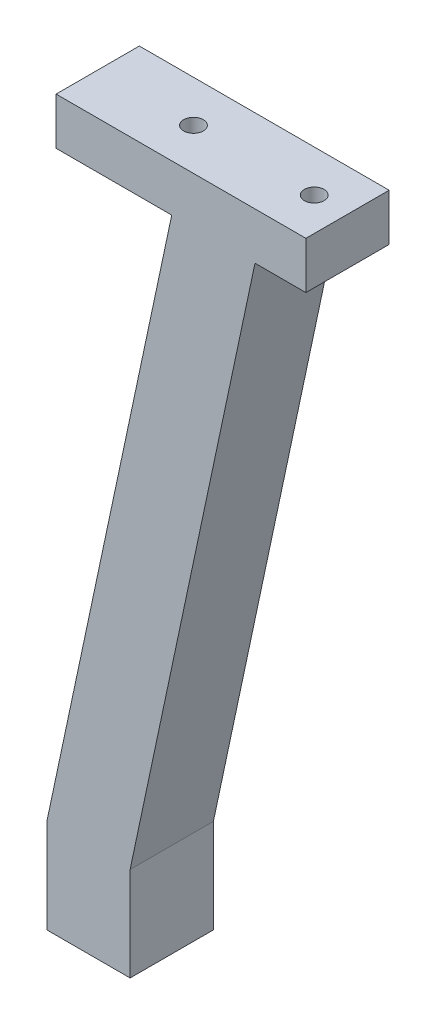
ISO-10303-21;
HEADER;
FILE_DESCRIPTION(('STEP AP214'),'2;1');
FILE_NAME('part.step','',(''),(''),'','','');
FILE_SCHEMA(('AUTOMOTIVE_DESIGN { 1 0 10303 214 1 1 1 1 }'));
ENDSEC;
DATA;
#1=APPLICATION_CONTEXT('core data for automotive mechanical design processes');
#2=APPLICATION_PROTOCOL_DEFINITION('international standard','automotive_design',2000,#1);
#3=PRODUCT_CONTEXT('',#1,'mechanical');
#4=PRODUCT('Part','Part','',(#3));
#5=PRODUCT_RELATED_PRODUCT_CATEGORY('part','',(#4));
#6=PRODUCT_DEFINITION_FORMATION('','',#4);
#7=PRODUCT_DEFINITION_CONTEXT('part definition',#1,'design');
#8=PRODUCT_DEFINITION('design','',#6,#7);
#9=PRODUCT_DEFINITION_SHAPE('','',#8);
#10=(LENGTH_UNIT() NAMED_UNIT(*) SI_UNIT(.MILLI.,.METRE.));
#11=(NAMED_UNIT(*) PLANE_ANGLE_UNIT() SI_UNIT($,.RADIAN.));
#12=(NAMED_UNIT(*) SI_UNIT($,.STERADIAN.) SOLID_ANGLE_UNIT());
#13=UNCERTAINTY_MEASURE_WITH_UNIT(LENGTH_MEASURE(1.E-05),#10,'distance_accuracy_value','');
#14=(GEOMETRIC_REPRESENTATION_CONTEXT(3) GLOBAL_UNCERTAINTY_ASSIGNED_CONTEXT((#13)) GLOBAL_UNIT_ASSIGNED_CONTEXT((#10,
#11,#12)) REPRESENTATION_CONTEXT('',''));
#15=CARTESIAN_POINT('',(0.,0.,0.));
#16=DIRECTION('',(0.,0.,1.));
#17=DIRECTION('',(1.,0.,0.));
#18=AXIS2_PLACEMENT_3D('',#15,#16,#17);
#19=CARTESIAN_POINT('',(37.8942820549233,137.16,-0.398563085800959));
#20=DIRECTION('',(0.,-1.,0.));
#21=DIRECTION('',(0.,0.,-1.));
#22=AXIS2_PLACEMENT_3D('',#19,#20,#21);
#23=CYLINDRICAL_SURFACE('',#22,2.125);
#24=CARTESIAN_POINT('',(37.8942820549233,137.16,-0.398563085800959));
#25=DIRECTION('',(0.,-1.,0.));
#26=DIRECTION('',(0.,0.,-1.));
#27=AXIS2_PLACEMENT_3D('',#24,#25,#26);
#28=CIRCLE('',#27,2.125);
#29=CARTESIAN_POINT('',(37.8942820549233,137.16,-2.52356308580096));
#30=VERTEX_POINT('',#29);
#31=EDGE_CURVE('E246',#30,#30,#28,.T.);
#32=ORIENTED_EDGE('',*,*,#31,.F.);
#33=EDGE_LOOP('',(#32));
#34=FACE_BOUND('',#33,.T.);
#35=CARTESIAN_POINT('',(37.8942820549233,130.,-0.398563085800959));
#36=DIRECTION('',(0.,-1.,0.));
#37=DIRECTION('',(0.,0.,-1.));
#38=AXIS2_PLACEMENT_3D('',#35,#36,#37);
#39=CIRCLE('',#38,2.125);
#40=CARTESIAN_POINT('',(37.8942820549233,130.,-2.52356308580096));
#41=VERTEX_POINT('',#40);
#42=EDGE_CURVE('E233',#41,#41,#39,.F.);
#43=ORIENTED_EDGE('',*,*,#42,.F.);
#44=EDGE_LOOP('',(#43));
#45=FACE_BOUND('',#44,.T.);
#46=ADVANCED_FACE('F35',(#34,#45),#23,.F.);
#47=CARTESIAN_POINT('',(11.7942820549233,137.16,-0.398563085800959));
#48=DIRECTION('',(0.,-1.,0.));
#49=DIRECTION('',(0.,0.,-1.));
#50=AXIS2_PLACEMENT_3D('',#47,#48,#49);
#51=CYLINDRICAL_SURFACE('',#50,2.125);
#52=CARTESIAN_POINT('',(11.7942820549233,137.16,-0.398563085800959));
#53=DIRECTION('',(0.,-1.,0.));
#54=DIRECTION('',(0.,0.,-1.));
#55=AXIS2_PLACEMENT_3D('',#52,#53,#54);
#56=CIRCLE('',#55,2.125);
#57=CARTESIAN_POINT('',(11.7942820549233,137.16,-2.52356308580096));
#58=VERTEX_POINT('',#57);
#59=EDGE_CURVE('E243',#58,#58,#56,.T.);
#60=ORIENTED_EDGE('',*,*,#59,.F.);
#61=EDGE_LOOP('',(#60));
#62=FACE_BOUND('',#61,.T.);
#63=CARTESIAN_POINT('',(11.7942820549233,130.,-0.398563085800959));
#64=DIRECTION('',(0.,-1.,0.));
#65=DIRECTION('',(0.,0.,-1.));
#66=AXIS2_PLACEMENT_3D('',#63,#64,#65);
#67=CIRCLE('',#66,2.125);
#68=CARTESIAN_POINT('',(11.7942820549233,130.,-2.52356308580096));
#69=VERTEX_POINT('',#68);
#70=EDGE_CURVE('E239',#69,#69,#67,.F.);
#71=ORIENTED_EDGE('',*,*,#70,.F.);
#72=EDGE_LOOP('',(#71));
#73=FACE_BOUND('',#72,.T.);
#74=ADVANCED_FACE('F360',(#62,#73),#51,.F.);
#75=CARTESIAN_POINT('',(16.0942820549233,127.,-9.39856308580096));
#76=DIRECTION('',(0.978147600733806,-0.207911690817756,0.));
#77=DIRECTION('',(0.207911690817756,0.978147600733806,0.));
#78=AXIS2_PLACEMENT_3D('',#75,#76,#77);
#79=PLANE('',#78);
#80=DIRECTION('',(0.,0.,1.));
#81=VECTOR('',#80,1.);
#82=CARTESIAN_POINT('',(16.0942820549233,127.,-9.39856308580096));
#83=LINE('',#82,#81);
#84=CARTESIAN_POINT('',(16.0942820549233,127.,1.60143691419904));
#85=VERTEX_POINT('',#84);
#86=CARTESIAN_POINT('',(16.0942820549233,127.,8.60143691419904));
#87=VERTEX_POINT('',#86);
#88=EDGE_CURVE('E39',#85,#87,#83,.T.);
#89=ORIENTED_EDGE('',*,*,#88,.F.);
#90=DIRECTION('',(0.207911690817756,0.978147600733806,0.));
#91=VECTOR('',#90,1.);
#92=CARTESIAN_POINT('',(16.0942820549233,127.,1.60143691419904));
#93=LINE('',#92,#91);
#94=CARTESIAN_POINT('',(11.9360482385682,107.437047985324,1.60143691419904));
#95=VERTEX_POINT('',#94);
#96=EDGE_CURVE('E54',#95,#85,#93,.T.);
#97=ORIENTED_EDGE('',*,*,#96,.F.);
#98=DIRECTION('',(0.,0.,1.));
#99=VECTOR('',#98,1.);
#100=CARTESIAN_POINT('',(11.9360482385682,107.437047985324,1.60143691419904));
#101=LINE('',#100,#99);
#102=CARTESIAN_POINT('',(11.9360482385682,107.437047985324,-2.39856308580096));
#103=VERTEX_POINT('',#102);
#104=EDGE_CURVE('E205',#103,#95,#101,.T.);
#105=ORIENTED_EDGE('',*,*,#104,.F.);
#106=DIRECTION('',(-0.207911690817756,-0.978147600733806,0.));
#107=VECTOR('',#106,1.);
#108=CARTESIAN_POINT('',(16.0942820549233,127.,-2.39856308580096));
#109=LINE('',#108,#107);
#110=CARTESIAN_POINT('',(16.0942820549233,127.,-2.39856308580096));
#111=VERTEX_POINT('',#110);
#112=EDGE_CURVE('E217',#111,#103,#109,.T.);
#113=ORIENTED_EDGE('',*,*,#112,.F.);
#114=CARTESIAN_POINT('',(16.0942820549233,127.,-9.39856308580096));
#115=VERTEX_POINT('',#114);
#116=EDGE_CURVE('E339',#115,#111,#83,.T.);
#117=ORIENTED_EDGE('',*,*,#116,.F.);
#118=DIRECTION('',(-0.207911690817756,-0.978147600733806,0.));
#119=VECTOR('',#118,1.);
#120=CARTESIAN_POINT('',(16.0942820549233,127.,-9.39856308580096));
#121=LINE('',#120,#119);
#122=CARTESIAN_POINT('',(-10.900401277169,0.,-9.39856308580096));
#123=VERTEX_POINT('',#122);
#124=EDGE_CURVE('E63',#115,#123,#121,.T.);
#125=ORIENTED_EDGE('',*,*,#124,.T.);
#126=DIRECTION('',(0.,0.,1.));
#127=VECTOR('',#126,1.);
#128=CARTESIAN_POINT('',(-10.900401277169,0.,-9.39856308580096));
#129=LINE('',#128,#127);
#130=CARTESIAN_POINT('',(-10.900401277169,0.,8.60143691419904));
#131=VERTEX_POINT('',#130);
#132=EDGE_CURVE('E194',#123,#131,#129,.T.);
#133=ORIENTED_EDGE('',*,*,#132,.T.);
#134=DIRECTION('',(-0.207911690817756,-0.978147600733806,0.));
#135=VECTOR('',#134,1.);
#136=CARTESIAN_POINT('',(16.0942820549233,127.,8.60143691419904));
#137=LINE('',#136,#135);
#138=EDGE_CURVE('E11',#87,#131,#137,.T.);
#139=ORIENTED_EDGE('',*,*,#138,.F.);
#140=EDGE_LOOP('',(#89,#97,#105,#113,#117,#125,#133,#139));
#141=FACE_BOUND('',#140,.T.);
#142=ADVANCED_FACE('F37',(#141),#79,.F.);
#143=CARTESIAN_POINT('',(16.0942820549233,127.,8.60143691419904));
#144=DIRECTION('',(0.,0.,-1.));
#145=DIRECTION('',(-1.,0.,0.));
#146=AXIS2_PLACEMENT_3D('',#143,#144,#145);
#147=PLANE('',#146);
#148=ORIENTED_EDGE('',*,*,#138,.T.);
#149=DIRECTION('',(0.,1.,0.));
#150=VECTOR('',#149,1.);
#151=CARTESIAN_POINT('',(-10.900401277169,-20.32,8.60143691419904));
#152=LINE('',#151,#150);
#153=CARTESIAN_POINT('',(-10.900401277169,-20.32,8.60143691419904));
#154=VERTEX_POINT('',#153);
#155=EDGE_CURVE('E420',#154,#131,#152,.T.);
#156=ORIENTED_EDGE('',*,*,#155,.F.);
#157=DIRECTION('',(-1.,0.,0.));
#158=VECTOR('',#157,1.);
#159=CARTESIAN_POINT('',(-10.900401277169,-20.32,8.60143691419904));
#160=LINE('',#159,#158);
#161=CARTESIAN_POINT('',(7.09959872283096,-20.32,8.60143691419904));
#162=VERTEX_POINT('',#161);
#163=EDGE_CURVE('E187',#162,#154,#160,.T.);
#164=ORIENTED_EDGE('',*,*,#163,.F.);
#165=DIRECTION('',(0.,1.,0.));
#166=VECTOR('',#165,1.);
#167=CARTESIAN_POINT('',(7.09959872283096,-20.32,8.60143691419904));
#168=LINE('',#167,#166);
#169=CARTESIAN_POINT('',(7.09959872283096,0.,8.60143691419904));
#170=VERTEX_POINT('',#169);
#171=EDGE_CURVE('E75',#162,#170,#168,.T.);
#172=ORIENTED_EDGE('',*,*,#171,.T.);
#173=DIRECTION('',(-0.207911690817756,-0.978147600733806,0.));
#174=VECTOR('',#173,1.);
#175=CARTESIAN_POINT('',(34.0942820549233,127.,8.60143691419904));
#176=LINE('',#175,#174);
#177=CARTESIAN_POINT('',(34.0942820549233,127.,8.60143691419904));
#178=VERTEX_POINT('',#177);
#179=EDGE_CURVE('E46',#178,#170,#176,.T.);
#180=ORIENTED_EDGE('',*,*,#179,.F.);
#181=DIRECTION('',(1.,0.,0.));
#182=VECTOR('',#181,1.);
#183=CARTESIAN_POINT('',(-8.9057179450767,127.,8.60143691419904));
#184=LINE('',#183,#182);
#185=CARTESIAN_POINT('',(45.0942820549233,127.,8.60143691419904));
#186=VERTEX_POINT('',#185);
#187=EDGE_CURVE('E299',#178,#186,#184,.T.);
#188=ORIENTED_EDGE('',*,*,#187,.T.);
#189=DIRECTION('',(0.,-1.,0.));
#190=VECTOR('',#189,1.);
#191=CARTESIAN_POINT('',(45.0942820549233,137.16,8.60143691419904));
#192=LINE('',#191,#190);
#193=CARTESIAN_POINT('',(45.0942820549233,137.16,8.60143691419904));
#194=VERTEX_POINT('',#193);
#195=EDGE_CURVE('E321',#194,#186,#192,.T.);
#196=ORIENTED_EDGE('',*,*,#195,.F.);
#197=DIRECTION('',(1.,0.,0.));
#198=VECTOR('',#197,1.);
#199=CARTESIAN_POINT('',(-8.9057179450767,137.16,8.60143691419904));
#200=LINE('',#199,#198);
#201=CARTESIAN_POINT('',(-8.9057179450767,137.16,8.60143691419904));
#202=VERTEX_POINT('',#201);
#203=EDGE_CURVE('E289',#202,#194,#200,.T.);
#204=ORIENTED_EDGE('',*,*,#203,.F.);
#205=DIRECTION('',(0.,-1.,0.));
#206=VECTOR('',#205,1.);
#207=CARTESIAN_POINT('',(-8.9057179450767,137.16,8.60143691419904));
#208=LINE('',#207,#206);
#209=CARTESIAN_POINT('',(-8.9057179450767,127.,8.60143691419904));
#210=VERTEX_POINT('',#209);
#211=EDGE_CURVE('E323',#202,#210,#208,.T.);
#212=ORIENTED_EDGE('',*,*,#211,.T.);
#213=EDGE_CURVE('E307',#210,#87,#184,.T.);
#214=ORIENTED_EDGE('',*,*,#213,.T.);
#215=EDGE_LOOP('',(#148,#156,#164,#172,#180,#188,#196,#204,#212,#214));
#216=FACE_BOUND('',#215,.T.);
#217=ADVANCED_FACE('F415',(#216),#147,.F.);
#218=CARTESIAN_POINT('',(34.0942820549233,127.,-9.39856308580096));
#219=DIRECTION('',(-0.978147600733806,0.207911690817756,0.));
#220=DIRECTION('',(-0.207911690817756,-0.978147600733806,0.));
#221=AXIS2_PLACEMENT_3D('',#218,#219,#220);
#222=PLANE('',#221);
#223=DIRECTION('',(0.,0.,-1.));
#224=VECTOR('',#223,1.);
#225=CARTESIAN_POINT('',(7.09959872283095,0.,-9.39856308580096));
#226=LINE('',#225,#224);
#227=CARTESIAN_POINT('',(7.09959872283096,0.,-9.39856308580096));
#228=VERTEX_POINT('',#227);
#229=EDGE_CURVE('E326',#170,#228,#226,.T.);
#230=ORIENTED_EDGE('',*,*,#229,.T.);
#231=DIRECTION('',(-0.207911690817756,-0.978147600733806,0.));
#232=VECTOR('',#231,1.);
#233=CARTESIAN_POINT('',(34.0942820549233,127.,-9.39856308580096));
#234=LINE('',#233,#232);
#235=CARTESIAN_POINT('',(34.0942820549233,127.,-9.39856308580096));
#236=VERTEX_POINT('',#235);
#237=EDGE_CURVE('E85',#236,#228,#234,.T.);
#238=ORIENTED_EDGE('',*,*,#237,.F.);
#239=DIRECTION('',(0.,0.,-1.));
#240=VECTOR('',#239,1.);
#241=CARTESIAN_POINT('',(34.0942820549233,127.,-9.39856308580096));
#242=LINE('',#241,#240);
#243=EDGE_CURVE('E337',#178,#236,#242,.T.);
#244=ORIENTED_EDGE('',*,*,#243,.F.);
#245=ORIENTED_EDGE('',*,*,#179,.T.);
#246=EDGE_LOOP('',(#230,#238,#244,#245));
#247=FACE_BOUND('',#246,.T.);
#248=ADVANCED_FACE('F413',(#247),#222,.F.);
#249=CARTESIAN_POINT('',(16.0942820549233,127.,-9.39856308580096));
#250=DIRECTION('',(0.,0.,1.));
#251=DIRECTION('',(1.,0.,0.));
#252=AXIS2_PLACEMENT_3D('',#249,#250,#251);
#253=PLANE('',#252);
#254=ORIENTED_EDGE('',*,*,#237,.T.);
#255=DIRECTION('',(0.,1.,0.));
#256=VECTOR('',#255,1.);
#257=CARTESIAN_POINT('',(7.09959872283096,-20.32,-9.39856308580096));
#258=LINE('',#257,#256);
#259=CARTESIAN_POINT('',(7.09959872283096,-20.32,-9.39856308580096));
#260=VERTEX_POINT('',#259);
#261=EDGE_CURVE('E179',#260,#228,#258,.T.);
#262=ORIENTED_EDGE('',*,*,#261,.F.);
#263=DIRECTION('',(1.,0.,0.));
#264=VECTOR('',#263,1.);
#265=CARTESIAN_POINT('',(-10.900401277169,-20.32,-9.39856308580096));
#266=LINE('',#265,#264);
#267=CARTESIAN_POINT('',(-10.900401277169,-20.32,-9.39856308580096));
#268=VERTEX_POINT('',#267);
#269=EDGE_CURVE('E173',#268,#260,#266,.T.);
#270=ORIENTED_EDGE('',*,*,#269,.F.);
#271=DIRECTION('',(0.,1.,0.));
#272=VECTOR('',#271,1.);
#273=CARTESIAN_POINT('',(-10.900401277169,-20.32,-9.39856308580096));
#274=LINE('',#273,#272);
#275=EDGE_CURVE('E177',#268,#123,#274,.T.);
#276=ORIENTED_EDGE('',*,*,#275,.T.);
#277=ORIENTED_EDGE('',*,*,#124,.F.);
#278=DIRECTION('',(-1.,0.,0.));
#279=VECTOR('',#278,1.);
#280=CARTESIAN_POINT('',(-8.9057179450767,127.,-9.39856308580096));
#281=LINE('',#280,#279);
#282=CARTESIAN_POINT('',(-8.9057179450767,127.,-9.39856308580096));
#283=VERTEX_POINT('',#282);
#284=EDGE_CURVE('E310',#115,#283,#281,.T.);
#285=ORIENTED_EDGE('',*,*,#284,.T.);
#286=DIRECTION('',(0.,-1.,0.));
#287=VECTOR('',#286,1.);
#288=CARTESIAN_POINT('',(-8.9057179450767,137.16,-9.39856308580096));
#289=LINE('',#288,#287);
#290=CARTESIAN_POINT('',(-8.9057179450767,137.16,-9.39856308580096));
#291=VERTEX_POINT('',#290);
#292=EDGE_CURVE('E296',#291,#283,#289,.T.);
#293=ORIENTED_EDGE('',*,*,#292,.F.);
#294=DIRECTION('',(-1.,0.,0.));
#295=VECTOR('',#294,1.);
#296=CARTESIAN_POINT('',(-8.9057179450767,137.16,-9.39856308580096));
#297=LINE('',#296,#295);
#298=CARTESIAN_POINT('',(45.0942820549233,137.16,-9.39856308580096));
#299=VERTEX_POINT('',#298);
#300=EDGE_CURVE('E294',#299,#291,#297,.T.);
#301=ORIENTED_EDGE('',*,*,#300,.F.);
#302=DIRECTION('',(0.,-1.,0.));
#303=VECTOR('',#302,1.);
#304=CARTESIAN_POINT('',(45.0942820549233,137.16,-9.39856308580096));
#305=LINE('',#304,#303);
#306=CARTESIAN_POINT('',(45.0942820549233,127.,-9.39856308580096));
#307=VERTEX_POINT('',#306);
#308=EDGE_CURVE('E318',#299,#307,#305,.T.);
#309=ORIENTED_EDGE('',*,*,#308,.T.);
#310=EDGE_CURVE('E290',#307,#236,#281,.T.);
#311=ORIENTED_EDGE('',*,*,#310,.T.);
#312=EDGE_LOOP('',(#254,#262,#270,#276,#277,#285,#293,#301,#309,#311));
#313=FACE_BOUND('',#312,.T.);
#314=ADVANCED_FACE('F175',(#313),#253,.F.);
#315=CARTESIAN_POINT('',(0.,127.,0.));
#316=DIRECTION('',(0.,1.,0.));
#317=DIRECTION('',(0.,0.,1.));
#318=AXIS2_PLACEMENT_3D('',#315,#316,#317);
#319=PLANE('',#318);
#320=CARTESIAN_POINT('',(11.7942820549233,127.,-0.398563085800959));
#321=DIRECTION('',(0.,-1.,0.));
#322=DIRECTION('',(0.,0.,-1.));
#323=AXIS2_PLACEMENT_3D('',#320,#321,#322);
#324=CIRCLE('',#323,3.3);
#325=CARTESIAN_POINT('',(11.7942820549233,127.,-3.69856308580096));
#326=VERTEX_POINT('',#325);
#327=EDGE_CURVE('E240',#326,#326,#324,.T.);
#328=ORIENTED_EDGE('',*,*,#327,.F.);
#329=EDGE_LOOP('',(#328));
#330=FACE_BOUND('',#329,.T.);
#331=ORIENTED_EDGE('',*,*,#284,.F.);
#332=ORIENTED_EDGE('',*,*,#116,.T.);
#333=DIRECTION('',(0.,0.,-1.));
#334=VECTOR('',#333,1.);
#335=CARTESIAN_POINT('',(16.0942820549233,127.,1.60143691419904));
#336=LINE('',#335,#334);
#337=EDGE_CURVE('E196',#85,#111,#336,.T.);
#338=ORIENTED_EDGE('',*,*,#337,.F.);
#339=ORIENTED_EDGE('',*,*,#88,.T.);
#340=ORIENTED_EDGE('',*,*,#213,.F.);
#341=DIRECTION('',(0.,0.,1.));
#342=VECTOR('',#341,1.);
#343=CARTESIAN_POINT('',(-8.9057179450767,127.,-9.39856308580096));
#344=LINE('',#343,#342);
#345=EDGE_CURVE('E277',#283,#210,#344,.T.);
#346=ORIENTED_EDGE('',*,*,#345,.F.);
#347=EDGE_LOOP('',(#331,#332,#338,#339,#340,#346));
#348=FACE_BOUND('',#347,.T.);
#349=ADVANCED_FACE('F399',(#330,#348),#319,.F.);
#350=CARTESIAN_POINT('',(37.8942820549233,127.,-0.398563085800959));
#351=DIRECTION('',(0.,-1.,0.));
#352=DIRECTION('',(0.,0.,-1.));
#353=AXIS2_PLACEMENT_3D('',#350,#351,#352);
#354=CIRCLE('',#353,3.3);
#355=CARTESIAN_POINT('',(37.8942820549233,127.,-3.69856308580096));
#356=VERTEX_POINT('',#355);
#357=EDGE_CURVE('E224',#356,#356,#354,.T.);
#358=ORIENTED_EDGE('',*,*,#357,.F.);
#359=EDGE_LOOP('',(#358));
#360=FACE_BOUND('',#359,.T.);
#361=ORIENTED_EDGE('',*,*,#187,.F.);
#362=ORIENTED_EDGE('',*,*,#243,.T.);
#363=ORIENTED_EDGE('',*,*,#310,.F.);
#364=DIRECTION('',(0.,0.,-1.));
#365=VECTOR('',#364,1.);
#366=CARTESIAN_POINT('',(45.0942820549233,127.,-9.39856308580096));
#367=LINE('',#366,#365);
#368=EDGE_CURVE('E302',#186,#307,#367,.T.);
#369=ORIENTED_EDGE('',*,*,#368,.F.);
#370=EDGE_LOOP('',(#361,#362,#363,#369));
#371=FACE_BOUND('',#370,.T.);
#372=ADVANCED_FACE('F402',(#360,#371),#319,.F.);
#373=CARTESIAN_POINT('',(-8.9057179450767,137.16,-9.39856308580096));
#374=DIRECTION('',(1.,0.,0.));
#375=DIRECTION('',(0.,0.,-1.));
#376=AXIS2_PLACEMENT_3D('',#373,#374,#375);
#377=PLANE('',#376);
#378=ORIENTED_EDGE('',*,*,#345,.T.);
#379=ORIENTED_EDGE('',*,*,#211,.F.);
#380=DIRECTION('',(0.,0.,1.));
#381=VECTOR('',#380,1.);
#382=CARTESIAN_POINT('',(-8.9057179450767,137.16,-9.39856308580096));
#383=LINE('',#382,#381);
#384=EDGE_CURVE('E286',#291,#202,#383,.T.);
#385=ORIENTED_EDGE('',*,*,#384,.F.);
#386=ORIENTED_EDGE('',*,*,#292,.T.);
#387=EDGE_LOOP('',(#378,#379,#385,#386));
#388=FACE_BOUND('',#387,.T.);
#389=ADVANCED_FACE('F406',(#388),#377,.F.);
#390=CARTESIAN_POINT('',(45.0942820549233,137.16,-9.39856308580096));
#391=DIRECTION('',(-1.,0.,0.));
#392=DIRECTION('',(0.,0.,1.));
#393=AXIS2_PLACEMENT_3D('',#390,#391,#392);
#394=PLANE('',#393);
#395=ORIENTED_EDGE('',*,*,#368,.T.);
#396=ORIENTED_EDGE('',*,*,#308,.F.);
#397=DIRECTION('',(0.,0.,-1.));
#398=VECTOR('',#397,1.);
#399=CARTESIAN_POINT('',(45.0942820549233,137.16,-9.39856308580096));
#400=LINE('',#399,#398);
#401=EDGE_CURVE('E292',#194,#299,#400,.T.);
#402=ORIENTED_EDGE('',*,*,#401,.F.);
#403=ORIENTED_EDGE('',*,*,#195,.T.);
#404=EDGE_LOOP('',(#395,#396,#402,#403));
#405=FACE_BOUND('',#404,.T.);
#406=ADVANCED_FACE('F397',(#405),#394,.F.);
#407=CARTESIAN_POINT('',(0.,137.16,0.));
#408=DIRECTION('',(0.,1.,0.));
#409=DIRECTION('',(0.,0.,1.));
#410=AXIS2_PLACEMENT_3D('',#407,#408,#409);
#411=PLANE('',#410);
#412=ORIENTED_EDGE('',*,*,#59,.T.);
#413=EDGE_LOOP('',(#412));
#414=FACE_BOUND('',#413,.T.);
#415=ORIENTED_EDGE('',*,*,#31,.T.);
#416=EDGE_LOOP('',(#415));
#417=FACE_BOUND('',#416,.T.);
#418=ORIENTED_EDGE('',*,*,#384,.T.);
#419=ORIENTED_EDGE('',*,*,#203,.T.);
#420=ORIENTED_EDGE('',*,*,#401,.T.);
#421=ORIENTED_EDGE('',*,*,#300,.T.);
#422=EDGE_LOOP('',(#418,#419,#420,#421));
#423=FACE_BOUND('',#422,.T.);
#424=ADVANCED_FACE('F393',(#414,#417,#423),#411,.T.);
#425=CARTESIAN_POINT('',(11.7942820549233,130.,-0.398563085800959));
#426=DIRECTION('',(0.,-1.,0.));
#427=DIRECTION('',(0.,0.,-1.));
#428=AXIS2_PLACEMENT_3D('',#425,#426,#427);
#429=PLANE('',#428);
#430=CARTESIAN_POINT('',(11.7942820549233,130.,-0.398563085800959));
#431=DIRECTION('',(0.,-1.,0.));
#432=DIRECTION('',(0.,0.,-1.));
#433=AXIS2_PLACEMENT_3D('',#430,#431,#432);
#434=CIRCLE('',#433,3.3);
#435=CARTESIAN_POINT('',(11.7942820549233,130.,-3.69856308580096));
#436=VERTEX_POINT('',#435);
#437=EDGE_CURVE('E236',#436,#436,#434,.T.);
#438=ORIENTED_EDGE('',*,*,#437,.T.);
#439=EDGE_LOOP('',(#438));
#440=FACE_BOUND('',#439,.T.);
#441=ORIENTED_EDGE('',*,*,#70,.T.);
#442=EDGE_LOOP('',(#441));
#443=FACE_BOUND('',#442,.T.);
#444=ADVANCED_FACE('F396',(#440,#443),#429,.T.);
#445=CARTESIAN_POINT('',(11.7942820549233,130.,-0.398563085800959));
#446=DIRECTION('',(0.,-1.,0.));
#447=DIRECTION('',(0.,0.,-1.));
#448=AXIS2_PLACEMENT_3D('',#445,#446,#447);
#449=CYLINDRICAL_SURFACE('',#448,3.3);
#450=ORIENTED_EDGE('',*,*,#437,.F.);
#451=EDGE_LOOP('',(#450));
#452=FACE_BOUND('',#451,.T.);
#453=ORIENTED_EDGE('',*,*,#327,.T.);
#454=EDGE_LOOP('',(#453));
#455=FACE_BOUND('',#454,.T.);
#456=ADVANCED_FACE('F456',(#452,#455),#449,.F.);
#457=CARTESIAN_POINT('',(37.8942820549233,130.,-0.398563085800959));
#458=DIRECTION('',(0.,-1.,0.));
#459=DIRECTION('',(0.,0.,-1.));
#460=AXIS2_PLACEMENT_3D('',#457,#458,#459);
#461=PLANE('',#460);
#462=CARTESIAN_POINT('',(37.8942820549233,130.,-0.398563085800959));
#463=DIRECTION('',(0.,-1.,0.));
#464=DIRECTION('',(0.,0.,-1.));
#465=AXIS2_PLACEMENT_3D('',#462,#463,#464);
#466=CIRCLE('',#465,3.3);
#467=CARTESIAN_POINT('',(37.8942820549233,130.,-3.69856308580096));
#468=VERTEX_POINT('',#467);
#469=EDGE_CURVE('E230',#468,#468,#466,.T.);
#470=ORIENTED_EDGE('',*,*,#469,.T.);
#471=EDGE_LOOP('',(#470));
#472=FACE_BOUND('',#471,.T.);
#473=ORIENTED_EDGE('',*,*,#42,.T.);
#474=EDGE_LOOP('',(#473));
#475=FACE_BOUND('',#474,.T.);
#476=ADVANCED_FACE('F357',(#472,#475),#461,.T.);
#477=CARTESIAN_POINT('',(37.8942820549233,130.,-0.398563085800959));
#478=DIRECTION('',(0.,-1.,0.));
#479=DIRECTION('',(0.,0.,-1.));
#480=AXIS2_PLACEMENT_3D('',#477,#478,#479);
#481=CYLINDRICAL_SURFACE('',#480,3.3);
#482=ORIENTED_EDGE('',*,*,#469,.F.);
#483=EDGE_LOOP('',(#482));
#484=FACE_BOUND('',#483,.T.);
#485=ORIENTED_EDGE('',*,*,#357,.T.);
#486=EDGE_LOOP('',(#485));
#487=FACE_BOUND('',#486,.T.);
#488=ADVANCED_FACE('F447',(#484,#487),#481,.F.);
#489=CARTESIAN_POINT('',(18.0505772563909,126.584176618365,1.60143691419904));
#490=DIRECTION('',(0.,0.,1.));
#491=DIRECTION('',(0.,-1.,0.));
#492=AXIS2_PLACEMENT_3D('',#489,#490,#491);
#493=PLANE('',#492);
#494=ORIENTED_EDGE('',*,*,#96,.T.);
#495=DIRECTION('',(-0.978147600733806,0.207911690817756,0.));
#496=VECTOR('',#495,1.);
#497=CARTESIAN_POINT('',(18.0505772563909,126.584176618365,1.60143691419904));
#498=LINE('',#497,#496);
#499=CARTESIAN_POINT('',(18.0505772563909,126.584176618365,1.60143691419904));
#500=VERTEX_POINT('',#499);
#501=EDGE_CURVE('E213',#500,#85,#498,.T.);
#502=ORIENTED_EDGE('',*,*,#501,.F.);
#503=DIRECTION('',(0.207911690817756,0.978147600733806,0.));
#504=VECTOR('',#503,1.);
#505=CARTESIAN_POINT('',(18.0505772563909,126.584176618365,1.60143691419904));
#506=LINE('',#505,#504);
#507=CARTESIAN_POINT('',(13.8923434400358,107.021224603688,1.60143691419904));
#508=VERTEX_POINT('',#507);
#509=EDGE_CURVE('E201',#508,#500,#506,.T.);
#510=ORIENTED_EDGE('',*,*,#509,.F.);
#511=DIRECTION('',(-0.978147600733806,0.207911690817756,0.));
#512=VECTOR('',#511,1.);
#513=CARTESIAN_POINT('',(13.8923434400358,107.021224603688,1.60143691419904));
#514=LINE('',#513,#512);
#515=EDGE_CURVE('E222',#508,#95,#514,.T.);
#516=ORIENTED_EDGE('',*,*,#515,.T.);
#517=EDGE_LOOP('',(#494,#502,#510,#516));
#518=FACE_BOUND('',#517,.T.);
#519=ADVANCED_FACE('F437',(#518),#493,.F.);
#520=CARTESIAN_POINT('',(13.8923434400358,107.021224603688,1.60143691419904));
#521=DIRECTION('',(-0.207911690817756,-0.978147600733806,0.));
#522=DIRECTION('',(0.978147600733806,-0.207911690817756,0.));
#523=AXIS2_PLACEMENT_3D('',#520,#521,#522);
#524=PLANE('',#523);
#525=ORIENTED_EDGE('',*,*,#104,.T.);
#526=ORIENTED_EDGE('',*,*,#515,.F.);
#527=DIRECTION('',(0.,0.,1.));
#528=VECTOR('',#527,1.);
#529=CARTESIAN_POINT('',(13.8923434400358,107.021224603688,1.60143691419904));
#530=LINE('',#529,#528);
#531=CARTESIAN_POINT('',(13.8923434400358,107.021224603688,-2.39856308580096));
#532=VERTEX_POINT('',#531);
#533=EDGE_CURVE('E211',#532,#508,#530,.T.);
#534=ORIENTED_EDGE('',*,*,#533,.F.);
#535=DIRECTION('',(-0.978147600733806,0.207911690817756,0.));
#536=VECTOR('',#535,1.);
#537=CARTESIAN_POINT('',(13.8923434400358,107.021224603688,-2.39856308580096));
#538=LINE('',#537,#536);
#539=EDGE_CURVE('E225',#532,#103,#538,.T.);
#540=ORIENTED_EDGE('',*,*,#539,.T.);
#541=EDGE_LOOP('',(#525,#526,#534,#540));
#542=FACE_BOUND('',#541,.T.);
#543=ADVANCED_FACE('F439',(#542),#524,.F.);
#544=CARTESIAN_POINT('',(18.0505772563909,126.584176618365,-2.39856308580096));
#545=DIRECTION('',(0.,0.,-1.));
#546=DIRECTION('',(-1.,0.,0.));
#547=AXIS2_PLACEMENT_3D('',#544,#545,#546);
#548=PLANE('',#547);
#549=ORIENTED_EDGE('',*,*,#112,.T.);
#550=ORIENTED_EDGE('',*,*,#539,.F.);
#551=DIRECTION('',(-0.207911690817756,-0.978147600733806,0.));
#552=VECTOR('',#551,1.);
#553=CARTESIAN_POINT('',(18.0505772563909,126.584176618365,-2.39856308580096));
#554=LINE('',#553,#552);
#555=CARTESIAN_POINT('',(18.0505772563909,126.584176618365,-2.39856308580096));
#556=VERTEX_POINT('',#555);
#557=EDGE_CURVE('E208',#556,#532,#554,.T.);
#558=ORIENTED_EDGE('',*,*,#557,.F.);
#559=DIRECTION('',(-0.978147600733806,0.207911690817756,0.));
#560=VECTOR('',#559,1.);
#561=CARTESIAN_POINT('',(18.0505772563909,126.584176618365,-2.39856308580096));
#562=LINE('',#561,#560);
#563=EDGE_CURVE('E227',#556,#111,#562,.T.);
#564=ORIENTED_EDGE('',*,*,#563,.T.);
#565=EDGE_LOOP('',(#549,#550,#558,#564));
#566=FACE_BOUND('',#565,.T.);
#567=ADVANCED_FACE('F432',(#566),#548,.F.);
#568=CARTESIAN_POINT('',(18.0505772563909,126.584176618365,1.60143691419904));
#569=DIRECTION('',(0.207911690817756,0.978147600733806,0.));
#570=DIRECTION('',(-0.978147600733806,0.207911690817756,0.));
#571=AXIS2_PLACEMENT_3D('',#568,#569,#570);
#572=PLANE('',#571);
#573=ORIENTED_EDGE('',*,*,#337,.T.);
#574=ORIENTED_EDGE('',*,*,#563,.F.);
#575=DIRECTION('',(0.,0.,-1.));
#576=VECTOR('',#575,1.);
#577=CARTESIAN_POINT('',(18.0505772563909,126.584176618365,1.60143691419904));
#578=LINE('',#577,#576);
#579=EDGE_CURVE('E204',#500,#556,#578,.T.);
#580=ORIENTED_EDGE('',*,*,#579,.F.);
#581=ORIENTED_EDGE('',*,*,#501,.T.);
#582=EDGE_LOOP('',(#573,#574,#580,#581));
#583=FACE_BOUND('',#582,.T.);
#584=ADVANCED_FACE('F428',(#583),#572,.F.);
#585=CARTESIAN_POINT('',(-8.47291147373662,1.8009729301919,0.));
#586=DIRECTION('',(0.978147600733806,-0.207911690817756,0.));
#587=DIRECTION('',(0.207911690817756,0.978147600733806,0.));
#588=AXIS2_PLACEMENT_3D('',#585,#586,#587);
#589=PLANE('',#588);
#590=ORIENTED_EDGE('',*,*,#509,.T.);
#591=ORIENTED_EDGE('',*,*,#579,.T.);
#592=ORIENTED_EDGE('',*,*,#557,.T.);
#593=ORIENTED_EDGE('',*,*,#533,.T.);
#594=EDGE_LOOP('',(#590,#591,#592,#593));
#595=FACE_BOUND('',#594,.T.);
#596=ADVANCED_FACE('F435',(#595),#589,.F.);
#597=CARTESIAN_POINT('',(-10.900401277169,-20.32,8.60143691419904));
#598=DIRECTION('',(1.,0.,0.));
#599=DIRECTION('',(0.,0.,-1.));
#600=AXIS2_PLACEMENT_3D('',#597,#598,#599);
#601=PLANE('',#600);
#602=ORIENTED_EDGE('',*,*,#132,.F.);
#603=ORIENTED_EDGE('',*,*,#275,.F.);
#604=DIRECTION('',(0.,0.,-1.));
#605=VECTOR('',#604,1.);
#606=CARTESIAN_POINT('',(-10.900401277169,-20.32,8.60143691419904));
#607=LINE('',#606,#605);
#608=EDGE_CURVE('E183',#154,#268,#607,.T.);
#609=ORIENTED_EDGE('',*,*,#608,.F.);
#610=ORIENTED_EDGE('',*,*,#155,.T.);
#611=EDGE_LOOP('',(#602,#603,#609,#610));
#612=FACE_BOUND('',#611,.T.);
#613=ADVANCED_FACE('F192',(#612),#601,.F.);
#614=CARTESIAN_POINT('',(7.09959872283096,-20.32,8.60143691419904));
#615=DIRECTION('',(-1.,0.,0.));
#616=DIRECTION('',(0.,0.,1.));
#617=AXIS2_PLACEMENT_3D('',#614,#615,#616);
#618=PLANE('',#617);
#619=ORIENTED_EDGE('',*,*,#229,.F.);
#620=ORIENTED_EDGE('',*,*,#171,.F.);
#621=DIRECTION('',(0.,0.,1.));
#622=VECTOR('',#621,1.);
#623=CARTESIAN_POINT('',(7.09959872283096,-20.32,8.60143691419904));
#624=LINE('',#623,#622);
#625=EDGE_CURVE('E182',#260,#162,#624,.T.);
#626=ORIENTED_EDGE('',*,*,#625,.F.);
#627=ORIENTED_EDGE('',*,*,#261,.T.);
#628=EDGE_LOOP('',(#619,#620,#626,#627));
#629=FACE_BOUND('',#628,.T.);
#630=ADVANCED_FACE('F548',(#629),#618,.F.);
#631=CARTESIAN_POINT('',(0.,-20.32,0.));
#632=DIRECTION('',(0.,-1.,0.));
#633=DIRECTION('',(0.,0.,-1.));
#634=AXIS2_PLACEMENT_3D('',#631,#632,#633);
#635=PLANE('',#634);
#636=CARTESIAN_POINT('',(-1.90040127716904,-20.32,-0.398563085800959));
#637=DIRECTION('',(0.,-1.,0.));
#638=DIRECTION('',(0.,0.,-1.));
#639=AXIS2_PLACEMENT_3D('',#636,#637,#638);
#640=CIRCLE('',#639,1.6764);
#641=CARTESIAN_POINT('',(-1.90040127716904,-20.32,-2.07496308580096));
#642=VERTEX_POINT('',#641);
#643=EDGE_CURVE('E703',#642,#642,#640,.T.);
#644=ORIENTED_EDGE('',*,*,#643,.F.);
#645=EDGE_LOOP('',(#644));
#646=FACE_BOUND('',#645,.T.);
#647=ORIENTED_EDGE('',*,*,#608,.T.);
#648=ORIENTED_EDGE('',*,*,#269,.T.);
#649=ORIENTED_EDGE('',*,*,#625,.T.);
#650=ORIENTED_EDGE('',*,*,#163,.T.);
#651=EDGE_LOOP('',(#647,#648,#649,#650));
#652=FACE_BOUND('',#651,.T.);
#653=ADVANCED_FACE('F186',(#646,#652),#635,.T.);
#654=CARTESIAN_POINT('',(-1.90040127716904,-5.08,-0.398563085800959));
#655=DIRECTION('',(0.,-1.,0.));
#656=DIRECTION('',(0.,0.,-1.));
#657=AXIS2_PLACEMENT_3D('',#654,#655,#656);
#658=CYLINDRICAL_SURFACE('',#657,1.6764);
#659=CARTESIAN_POINT('',(-1.90040127716904,-5.08,-0.398563085800959));
#660=DIRECTION('',(0.,-1.,0.));
#661=DIRECTION('',(0.,0.,-1.));
#662=AXIS2_PLACEMENT_3D('',#659,#660,#661);
#663=CIRCLE('',#662,1.6764);
#664=CARTESIAN_POINT('',(-1.90040127716904,-5.08,-2.07496308580096));
#665=VERTEX_POINT('',#664);
#666=EDGE_CURVE('E190',#665,#665,#663,.T.);
#667=CARTESIAN_POINT('',(-1.90040127716904,-5.08,-2.07496308580096));
#668=CARTESIAN_POINT('',(-1.90040127716904,-5.23875,-2.07496308580096));
#669=CARTESIAN_POINT('',(-1.90040127716904,-5.3975,-2.07496308580096));
#670=CARTESIAN_POINT('',(-1.90040127716904,-5.715,-2.07496308580096));
#671=CARTESIAN_POINT('',(-1.90040127716904,-5.87375,-2.07496308580096));
#672=CARTESIAN_POINT('',(-1.90040127716904,-6.19125,-2.07496308580096));
#673=CARTESIAN_POINT('',(-1.90040127716904,-6.35,-2.07496308580096));
#674=CARTESIAN_POINT('',(-1.90040127716904,-6.6675,-2.07496308580096));
#675=CARTESIAN_POINT('',(-1.90040127716904,-6.82625,-2.07496308580096));
#676=CARTESIAN_POINT('',(-1.90040127716904,-7.14375,-2.07496308580096));
#677=CARTESIAN_POINT('',(-1.90040127716904,-7.3025,-2.07496308580096));
#678=CARTESIAN_POINT('',(-1.90040127716904,-7.62,-2.07496308580096));
#679=CARTESIAN_POINT('',(-1.90040127716904,-7.77875,-2.07496308580096));
#680=CARTESIAN_POINT('',(-1.90040127716904,-8.09625,-2.07496308580096));
#681=CARTESIAN_POINT('',(-1.90040127716904,-8.255,-2.07496308580096));
#682=CARTESIAN_POINT('',(-1.90040127716904,-8.5725,-2.07496308580096));
#683=CARTESIAN_POINT('',(-1.90040127716904,-8.73125,-2.07496308580096));
#684=CARTESIAN_POINT('',(-1.90040127716904,-9.04875,-2.07496308580096));
#685=CARTESIAN_POINT('',(-1.90040127716904,-9.2075,-2.07496308580096));
#686=CARTESIAN_POINT('',(-1.90040127716904,-9.525,-2.07496308580096));
#687=CARTESIAN_POINT('',(-1.90040127716904,-9.68375,-2.07496308580096));
#688=CARTESIAN_POINT('',(-1.90040127716904,-10.00125,-2.07496308580096));
#689=CARTESIAN_POINT('',(-1.90040127716904,-10.16,-2.07496308580096));
#690=CARTESIAN_POINT('',(-1.90040127716904,-10.4775,-2.07496308580096));
#691=CARTESIAN_POINT('',(-1.90040127716904,-10.63625,-2.07496308580096));
#692=CARTESIAN_POINT('',(-1.90040127716904,-10.95375,-2.07496308580096));
#693=CARTESIAN_POINT('',(-1.90040127716904,-11.1125,-2.07496308580096));
#694=CARTESIAN_POINT('',(-1.90040127716904,-11.43,-2.07496308580096));
#695=CARTESIAN_POINT('',(-1.90040127716904,-11.58875,-2.07496308580096));
#696=CARTESIAN_POINT('',(-1.90040127716904,-11.90625,-2.07496308580096));
#697=CARTESIAN_POINT('',(-1.90040127716904,-12.065,-2.07496308580096));
#698=CARTESIAN_POINT('',(-1.90040127716904,-12.3825,-2.07496308580096));
#699=CARTESIAN_POINT('',(-1.90040127716904,-12.54125,-2.07496308580096));
#700=CARTESIAN_POINT('',(-1.90040127716904,-12.85875,-2.07496308580096));
#701=CARTESIAN_POINT('',(-1.90040127716904,-13.0175,-2.07496308580096));
#702=CARTESIAN_POINT('',(-1.90040127716904,-13.335,-2.07496308580096));
#703=CARTESIAN_POINT('',(-1.90040127716904,-13.49375,-2.07496308580096));
#704=CARTESIAN_POINT('',(-1.90040127716904,-13.81125,-2.07496308580096));
#705=CARTESIAN_POINT('',(-1.90040127716904,-13.97,-2.07496308580096));
#706=CARTESIAN_POINT('',(-1.90040127716904,-14.2875,-2.07496308580096));
#707=CARTESIAN_POINT('',(-1.90040127716904,-14.44625,-2.07496308580096));
#708=CARTESIAN_POINT('',(-1.90040127716904,-14.76375,-2.07496308580096));
#709=CARTESIAN_POINT('',(-1.90040127716904,-14.9225,-2.07496308580096));
#710=CARTESIAN_POINT('',(-1.90040127716904,-15.24,-2.07496308580096));
#711=CARTESIAN_POINT('',(-1.90040127716904,-15.39875,-2.07496308580096));
#712=CARTESIAN_POINT('',(-1.90040127716904,-15.71625,-2.07496308580096));
#713=CARTESIAN_POINT('',(-1.90040127716904,-15.875,-2.07496308580096));
#714=CARTESIAN_POINT('',(-1.90040127716904,-16.1925,-2.07496308580096));
#715=CARTESIAN_POINT('',(-1.90040127716904,-16.35125,-2.07496308580096));
#716=CARTESIAN_POINT('',(-1.90040127716904,-16.66875,-2.07496308580096));
#717=CARTESIAN_POINT('',(-1.90040127716904,-16.8275,-2.07496308580096));
#718=CARTESIAN_POINT('',(-1.90040127716904,-17.145,-2.07496308580096));
#719=CARTESIAN_POINT('',(-1.90040127716904,-17.30375,-2.07496308580096));
#720=CARTESIAN_POINT('',(-1.90040127716904,-17.62125,-2.07496308580096));
#721=CARTESIAN_POINT('',(-1.90040127716904,-17.78,-2.07496308580096));
#722=CARTESIAN_POINT('',(-1.90040127716904,-18.0975,-2.07496308580096));
#723=CARTESIAN_POINT('',(-1.90040127716904,-18.25625,-2.07496308580096));
#724=CARTESIAN_POINT('',(-1.90040127716904,-18.57375,-2.07496308580096));
#725=CARTESIAN_POINT('',(-1.90040127716904,-18.7325,-2.07496308580096));
#726=CARTESIAN_POINT('',(-1.90040127716904,-19.05,-2.07496308580096));
#727=CARTESIAN_POINT('',(-1.90040127716904,-19.20875,-2.07496308580096));
#728=CARTESIAN_POINT('',(-1.90040127716904,-19.52625,-2.07496308580096));
#729=CARTESIAN_POINT('',(-1.90040127716904,-19.685,-2.07496308580096));
#730=CARTESIAN_POINT('',(-1.90040127716904,-20.0025,-2.07496308580096));
#731=CARTESIAN_POINT('',(-1.90040127716904,-20.16125,-2.07496308580096));
#732=CARTESIAN_POINT('',(-1.90040127716904,-20.32,-2.07496308580096));
#733=B_SPLINE_CURVE_WITH_KNOTS('',3,(#667,#668,#669,#670,#671,#672,#673,#674,#675,#676,#677,
#678,#679,#680,#681,#682,#683,#684,#685,#686,#687,#688,#689,#690,#691,#692,#693,#694,#695,#696,
#697,#698,#699,#700,#701,#702,#703,#704,#705,#706,#707,#708,#709,#710,#711,#712,#713,#714,#715,
#716,#717,#718,#719,#720,#721,#722,#723,#724,#725,#726,#727,#728,#729,#730,#731,#732),
.UNSPECIFIED.,.F.,.F.,(4,2,2,2,2,2,2,2,2,2,2,2,2,2,2,2,2,2,2,2,2,2,2,2,2,2,2,2,2,2,2,2,4),(0.,
0.47625,0.9525,1.42875,1.905,2.38125,2.8575,3.33375,3.81,4.28625,4.7625,5.23875,5.715,6.19125,
6.6675,7.14375,7.62,8.09625,8.5725,9.04875,9.525,10.00125,10.4775,10.95375,11.43,11.90625,
12.3825,12.85875,13.335,13.81125,14.2875,14.76375,15.24),.UNSPECIFIED.);
#734=EDGE_CURVE('BSEAM601',#665,#642,#733,.T.);
#735=ORIENTED_EDGE('',*,*,#666,.F.);
#736=ORIENTED_EDGE('',*,*,#643,.T.);
#737=ORIENTED_EDGE('',*,*,#734,.T.);
#738=ORIENTED_EDGE('',*,*,#734,.F.);
#739=EDGE_LOOP('',(#735,#737,#736,#738));
#740=FACE_BOUND('',#739,.T.);
#741=ADVANCED_FACE('F601',(#740),#658,.F.);
#742=CARTESIAN_POINT('',(-1.90040127716904,-5.08,-0.398563085800959));
#743=DIRECTION('',(0.,-1.,0.));
#744=DIRECTION('',(0.,0.,-1.));
#745=AXIS2_PLACEMENT_3D('',#742,#743,#744);
#746=PLANE('',#745);
#747=ORIENTED_EDGE('',*,*,#666,.T.);
#748=EDGE_LOOP('',(#747));
#749=FACE_BOUND('',#748,.T.);
#750=ADVANCED_FACE('F610',(#749),#746,.T.);
#751=CLOSED_SHELL('',(#46,#74,#142,#217,#248,#314,#349,#372,#389,#406,#424,#444,#456,#476,#488,
#519,#543,#567,#584,#596,#613,#630,#653,#741,#750));
#752=CARTESIAN_POINT('',(15.842870840313,74.534847175916,0.));
#753=DIRECTION('',(0.,-1.,0.));
#754=DIRECTION('',(0.,0.,-1.));
#755=AXIS2_PLACEMENT_3D('',#752,#753,#754);
#756=PLANE('',#755);
#757=DIRECTION('',(0.,0.,-1.));
#758=VECTOR('',#757,1.);
#759=CARTESIAN_POINT('',(9.94246956314395,74.534847175916,3.60143691419904));
#760=LINE('',#759,#758);
#761=CARTESIAN_POINT('',(9.94246956314395,74.534847175916,3.60143691419904));
#762=VERTEX_POINT('',#761);
#763=CARTESIAN_POINT('',(9.94246956314395,74.534847175916,-4.39856308580096));
#764=VERTEX_POINT('',#763);
#765=EDGE_CURVE('E250',#762,#764,#760,.T.);
#766=ORIENTED_EDGE('',*,*,#765,.T.);
#767=DIRECTION('',(1.,0.,0.));
#768=VECTOR('',#767,1.);
#769=CARTESIAN_POINT('',(9.94246956314395,74.534847175916,-4.39856308580096));
#770=LINE('',#769,#768);
#771=CARTESIAN_POINT('',(17.942469563144,74.534847175916,-4.39856308580096));
#772=VERTEX_POINT('',#771);
#773=EDGE_CURVE('E253',#764,#772,#770,.T.);
#774=ORIENTED_EDGE('',*,*,#773,.T.);
#775=DIRECTION('',(0.,0.,1.));
#776=VECTOR('',#775,1.);
#777=CARTESIAN_POINT('',(17.942469563144,74.534847175916,3.60143691419904));
#778=LINE('',#777,#776);
#779=CARTESIAN_POINT('',(17.942469563144,74.534847175916,3.60143691419904));
#780=VERTEX_POINT('',#779);
#781=EDGE_CURVE('E257',#772,#780,#778,.T.);
#782=ORIENTED_EDGE('',*,*,#781,.T.);
#783=DIRECTION('',(-1.,0.,0.));
#784=VECTOR('',#783,1.);
#785=CARTESIAN_POINT('',(9.94246956314395,74.534847175916,3.60143691419904));
#786=LINE('',#785,#784);
#787=EDGE_CURVE('E260',#780,#762,#786,.T.);
#788=ORIENTED_EDGE('',*,*,#787,.T.);
#789=EDGE_LOOP('',(#766,#774,#782,#788));
#790=FACE_BOUND('',#789,.T.);
#791=ADVANCED_FACE('F371',(#790),#756,.T.);
#792=CARTESIAN_POINT('',(9.94246956314395,74.534847175916,-4.39856308580096));
#793=DIRECTION('',(0.,0.,-1.));
#794=DIRECTION('',(-1.,0.,0.));
#795=AXIS2_PLACEMENT_3D('',#792,#793,#794);
#796=PLANE('',#795);
#797=DIRECTION('',(1.,0.,0.));
#798=VECTOR('',#797,1.);
#799=CARTESIAN_POINT('',(-5.90040127716905,0.,-4.39856308580096));
#800=LINE('',#799,#798);
#801=CARTESIAN_POINT('',(-5.90040127716904,0.,-4.39856308580096));
#802=VERTEX_POINT('',#801);
#803=CARTESIAN_POINT('',(2.09959872283096,0.,-4.39856308580096));
#804=VERTEX_POINT('',#803);
#805=EDGE_CURVE('E266',#802,#804,#800,.T.);
#806=ORIENTED_EDGE('',*,*,#805,.T.);
#807=DIRECTION('',(-0.207911690817756,-0.978147600733806,0.));
#808=VECTOR('',#807,1.);
#809=CARTESIAN_POINT('',(17.942469563144,74.534847175916,-4.39856308580096));
#810=LINE('',#809,#808);
#811=EDGE_CURVE('E281',#772,#804,#810,.T.);
#812=ORIENTED_EDGE('',*,*,#811,.F.);
#813=ORIENTED_EDGE('',*,*,#773,.F.);
#814=DIRECTION('',(-0.207911690817756,-0.978147600733806,0.));
#815=VECTOR('',#814,1.);
#816=CARTESIAN_POINT('',(9.94246956314395,74.534847175916,-4.39856308580096));
#817=LINE('',#816,#815);
#818=EDGE_CURVE('E263',#764,#802,#817,.T.);
#819=ORIENTED_EDGE('',*,*,#818,.T.);
#820=EDGE_LOOP('',(#806,#812,#813,#819));
#821=FACE_BOUND('',#820,.T.);
#822=ADVANCED_FACE('F374',(#821),#796,.F.);
#823=CARTESIAN_POINT('',(17.942469563144,74.534847175916,3.60143691419904));
#824=DIRECTION('',(0.978147600733806,-0.207911690817756,0.));
#825=DIRECTION('',(0.207911690817756,0.978147600733806,0.));
#826=AXIS2_PLACEMENT_3D('',#823,#824,#825);
#827=PLANE('',#826);
#828=DIRECTION('',(0.,0.,1.));
#829=VECTOR('',#828,1.);
#830=CARTESIAN_POINT('',(2.09959872283096,0.,3.60143691419904));
#831=LINE('',#830,#829);
#832=CARTESIAN_POINT('',(2.09959872283095,0.,3.60143691419904));
#833=VERTEX_POINT('',#832);
#834=EDGE_CURVE('E269',#804,#833,#831,.T.);
#835=ORIENTED_EDGE('',*,*,#834,.T.);
#836=DIRECTION('',(-0.207911690817756,-0.978147600733806,0.));
#837=VECTOR('',#836,1.);
#838=CARTESIAN_POINT('',(17.942469563144,74.534847175916,3.60143691419904));
#839=LINE('',#838,#837);
#840=EDGE_CURVE('E278',#780,#833,#839,.T.);
#841=ORIENTED_EDGE('',*,*,#840,.F.);
#842=ORIENTED_EDGE('',*,*,#781,.F.);
#843=ORIENTED_EDGE('',*,*,#811,.T.);
#844=EDGE_LOOP('',(#835,#841,#842,#843));
#845=FACE_BOUND('',#844,.T.);
#846=ADVANCED_FACE('F381',(#845),#827,.F.);
#847=CARTESIAN_POINT('',(9.94246956314395,74.534847175916,3.60143691419904));
#848=DIRECTION('',(0.,0.,1.));
#849=DIRECTION('',(1.,0.,0.));
#850=AXIS2_PLACEMENT_3D('',#847,#848,#849);
#851=PLANE('',#850);
#852=DIRECTION('',(-1.,0.,0.));
#853=VECTOR('',#852,1.);
#854=CARTESIAN_POINT('',(-5.90040127716905,0.,3.60143691419904));
#855=LINE('',#854,#853);
#856=CARTESIAN_POINT('',(-5.90040127716905,0.,3.60143691419904));
#857=VERTEX_POINT('',#856);
#858=EDGE_CURVE('E254',#833,#857,#855,.T.);
#859=ORIENTED_EDGE('',*,*,#858,.T.);
#860=DIRECTION('',(-0.207911690817756,-0.978147600733806,0.));
#861=VECTOR('',#860,1.);
#862=CARTESIAN_POINT('',(9.94246956314395,74.534847175916,3.60143691419904));
#863=LINE('',#862,#861);
#864=EDGE_CURVE('E274',#762,#857,#863,.T.);
#865=ORIENTED_EDGE('',*,*,#864,.F.);
#866=ORIENTED_EDGE('',*,*,#787,.F.);
#867=ORIENTED_EDGE('',*,*,#840,.T.);
#868=EDGE_LOOP('',(#859,#865,#866,#867));
#869=FACE_BOUND('',#868,.T.);
#870=ADVANCED_FACE('F377',(#869),#851,.F.);
#871=CARTESIAN_POINT('',(9.94246956314395,74.534847175916,3.60143691419904));
#872=DIRECTION('',(-0.978147600733806,0.207911690817756,0.));
#873=DIRECTION('',(-0.207911690817756,-0.978147600733806,0.));
#874=AXIS2_PLACEMENT_3D('',#871,#872,#873);
#875=PLANE('',#874);
#876=DIRECTION('',(0.,0.,-1.));
#877=VECTOR('',#876,1.);
#878=CARTESIAN_POINT('',(-5.90040127716905,0.,3.60143691419904));
#879=LINE('',#878,#877);
#880=EDGE_CURVE('E249',#857,#802,#879,.T.);
#881=ORIENTED_EDGE('',*,*,#880,.T.);
#882=ORIENTED_EDGE('',*,*,#818,.F.);
#883=ORIENTED_EDGE('',*,*,#765,.F.);
#884=ORIENTED_EDGE('',*,*,#864,.T.);
#885=EDGE_LOOP('',(#881,#882,#883,#884));
#886=FACE_BOUND('',#885,.T.);
#887=ADVANCED_FACE('F380',(#886),#875,.F.);
#888=CARTESIAN_POINT('',(0.,0.,0.));
#889=DIRECTION('',(0.,-1.,0.));
#890=DIRECTION('',(0.,0.,-1.));
#891=AXIS2_PLACEMENT_3D('',#888,#889,#890);
#892=PLANE('',#891);
#893=ORIENTED_EDGE('',*,*,#805,.F.);
#894=ORIENTED_EDGE('',*,*,#880,.F.);
#895=ORIENTED_EDGE('',*,*,#858,.F.);
#896=ORIENTED_EDGE('',*,*,#834,.F.);
#897=EDGE_LOOP('',(#893,#894,#895,#896));
#898=FACE_BOUND('',#897,.T.);
#899=ADVANCED_FACE('F391',(#898),#892,.F.);
#900=CLOSED_SHELL('',(#791,#822,#846,#870,#887,#899));
#901=ORIENTED_CLOSED_SHELL('',*,#900,.T.);
#902=BREP_WITH_VOIDS('B2',#751,(#901));
#903=ADVANCED_BREP_SHAPE_REPRESENTATION('',(#18,#902),#14);
#904=SHAPE_DEFINITION_REPRESENTATION(#9,#903);
ENDSEC;
END-ISO-10303-21;
